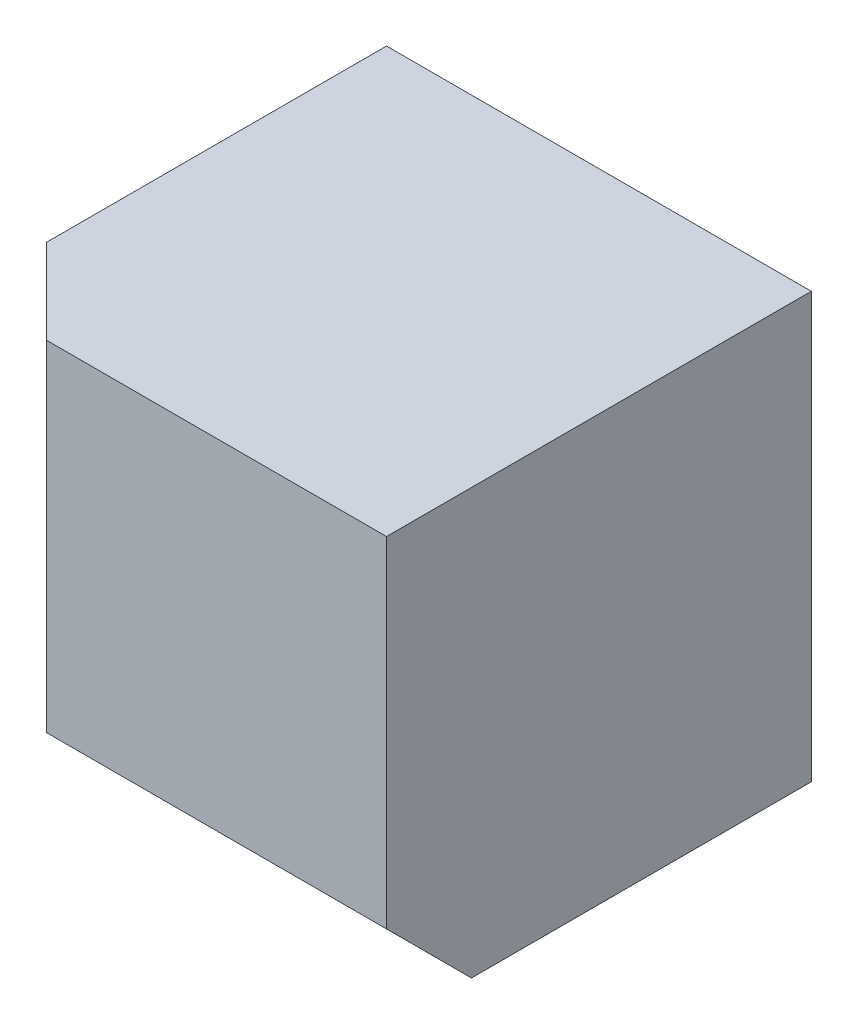
ISO-10303-21;
HEADER;
FILE_DESCRIPTION(('STEP AP214'),'2;1');
FILE_NAME('part.step','',(''),(''),'','','');
FILE_SCHEMA(('AUTOMOTIVE_DESIGN { 1 0 10303 214 1 1 1 1 }'));
ENDSEC;
DATA;
#1=APPLICATION_CONTEXT('core data for automotive mechanical design processes');
#2=APPLICATION_PROTOCOL_DEFINITION('international standard','automotive_design',2000,#1);
#3=PRODUCT_CONTEXT('',#1,'mechanical');
#4=PRODUCT('Part','Part','',(#3));
#5=PRODUCT_RELATED_PRODUCT_CATEGORY('part','',(#4));
#6=PRODUCT_DEFINITION_FORMATION('','',#4);
#7=PRODUCT_DEFINITION_CONTEXT('part definition',#1,'design');
#8=PRODUCT_DEFINITION('design','',#6,#7);
#9=PRODUCT_DEFINITION_SHAPE('','',#8);
#10=(LENGTH_UNIT() NAMED_UNIT(*) SI_UNIT(.MILLI.,.METRE.));
#11=(NAMED_UNIT(*) PLANE_ANGLE_UNIT() SI_UNIT($,.RADIAN.));
#12=(NAMED_UNIT(*) SI_UNIT($,.STERADIAN.) SOLID_ANGLE_UNIT());
#13=UNCERTAINTY_MEASURE_WITH_UNIT(LENGTH_MEASURE(1.E-05),#10,'distance_accuracy_value','');
#14=(GEOMETRIC_REPRESENTATION_CONTEXT(3) GLOBAL_UNCERTAINTY_ASSIGNED_CONTEXT((#13)) GLOBAL_UNIT_ASSIGNED_CONTEXT((#10,
#11,#12)) REPRESENTATION_CONTEXT('',''));
#15=CARTESIAN_POINT('',(0.,0.,0.));
#16=DIRECTION('',(0.,0.,1.));
#17=DIRECTION('',(1.,0.,0.));
#18=AXIS2_PLACEMENT_3D('',#15,#16,#17);
#19=CARTESIAN_POINT('',(-5.,-5.,10.));
#20=DIRECTION('',(-1.,0.,0.));
#21=DIRECTION('',(0.,0.,1.));
#22=AXIS2_PLACEMENT_3D('',#19,#20,#21);
#23=PLANE('',#22);
#24=DIRECTION('',(0.,0.,-1.));
#25=VECTOR('',#24,1.);
#26=CARTESIAN_POINT('',(-5.,-5.,10.));
#27=LINE('',#26,#25);
#28=CARTESIAN_POINT('',(-5.,-5.,7.99999999999999));
#29=VERTEX_POINT('',#28);
#30=CARTESIAN_POINT('',(-5.,-5.,0.));
#31=VERTEX_POINT('',#30);
#32=EDGE_CURVE('E104',#29,#31,#27,.T.);
#33=ORIENTED_EDGE('',*,*,#32,.F.);
#34=DIRECTION('',(0.,1.,0.));
#35=VECTOR('',#34,1.);
#36=CARTESIAN_POINT('',(-5.,5.,7.99999999999999));
#37=LINE('',#36,#35);
#38=CARTESIAN_POINT('',(-5.,5.,7.99999999999999));
#39=VERTEX_POINT('',#38);
#40=EDGE_CURVE('E109',#29,#39,#37,.T.);
#41=ORIENTED_EDGE('',*,*,#40,.T.);
#42=DIRECTION('',(0.,0.,-1.));
#43=VECTOR('',#42,1.);
#44=CARTESIAN_POINT('',(-5.,5.,10.));
#45=LINE('',#44,#43);
#46=CARTESIAN_POINT('',(-5.,5.,0.));
#47=VERTEX_POINT('',#46);
#48=EDGE_CURVE('E87',#39,#47,#45,.T.);
#49=ORIENTED_EDGE('',*,*,#48,.T.);
#50=DIRECTION('',(0.,1.,0.));
#51=VECTOR('',#50,1.);
#52=CARTESIAN_POINT('',(-5.,-5.,0.));
#53=LINE('',#52,#51);
#54=EDGE_CURVE('E126',#31,#47,#53,.T.);
#55=ORIENTED_EDGE('',*,*,#54,.F.);
#56=EDGE_LOOP('',(#33,#41,#49,#55));
#57=FACE_BOUND('',#56,.T.);
#58=ADVANCED_FACE('F33',(#57),#23,.T.);
#59=CARTESIAN_POINT('',(-5.,-5.,10.));
#60=DIRECTION('',(0.,1.,0.));
#61=DIRECTION('',(0.,0.,1.));
#62=AXIS2_PLACEMENT_3D('',#59,#60,#61);
#63=PLANE('',#62);
#64=DIRECTION('',(0.,0.,-1.));
#65=VECTOR('',#64,1.);
#66=CARTESIAN_POINT('',(5.,-5.,10.));
#67=LINE('',#66,#65);
#68=CARTESIAN_POINT('',(5.,-5.,7.99999999999999));
#69=VERTEX_POINT('',#68);
#70=CARTESIAN_POINT('',(5.,-5.,0.));
#71=VERTEX_POINT('',#70);
#72=EDGE_CURVE('E102',#69,#71,#67,.T.);
#73=ORIENTED_EDGE('',*,*,#72,.F.);
#74=DIRECTION('',(-1.,0.,0.));
#75=VECTOR('',#74,1.);
#76=CARTESIAN_POINT('',(-5.,-5.,7.99999999999999));
#77=LINE('',#76,#75);
#78=EDGE_CURVE('E11',#69,#29,#77,.T.);
#79=ORIENTED_EDGE('',*,*,#78,.T.);
#80=ORIENTED_EDGE('',*,*,#32,.T.);
#81=DIRECTION('',(1.,0.,0.));
#82=VECTOR('',#81,1.);
#83=CARTESIAN_POINT('',(-5.,-5.,0.));
#84=LINE('',#83,#82);
#85=EDGE_CURVE('E96',#31,#71,#84,.T.);
#86=ORIENTED_EDGE('',*,*,#85,.T.);
#87=EDGE_LOOP('',(#73,#79,#80,#86));
#88=FACE_BOUND('',#87,.T.);
#89=ADVANCED_FACE('F136',(#88),#63,.F.);
#90=CARTESIAN_POINT('',(5.,-5.,10.));
#91=DIRECTION('',(-1.,0.,0.));
#92=DIRECTION('',(0.,0.,1.));
#93=AXIS2_PLACEMENT_3D('',#90,#91,#92);
#94=PLANE('',#93);
#95=DIRECTION('',(0.,1.,0.));
#96=VECTOR('',#95,1.);
#97=CARTESIAN_POINT('',(5.,-5.,10.));
#98=LINE('',#97,#96);
#99=CARTESIAN_POINT('',(5.,-3.,10.));
#100=VERTEX_POINT('',#99);
#101=CARTESIAN_POINT('',(5.,5.,10.));
#102=VERTEX_POINT('',#101);
#103=EDGE_CURVE('E81',#100,#102,#98,.T.);
#104=ORIENTED_EDGE('',*,*,#103,.F.);
#105=DIRECTION('',(0.,0.707106781186546,0.707106781186549));
#106=VECTOR('',#105,1.);
#107=CARTESIAN_POINT('',(5.,-3.,10.));
#108=LINE('',#107,#106);
#109=EDGE_CURVE('E42',#100,#69,#108,.F.);
#110=ORIENTED_EDGE('',*,*,#109,.T.);
#111=ORIENTED_EDGE('',*,*,#72,.T.);
#112=DIRECTION('',(0.,1.,0.));
#113=VECTOR('',#112,1.);
#114=CARTESIAN_POINT('',(5.,-5.,0.));
#115=LINE('',#114,#113);
#116=CARTESIAN_POINT('',(5.,5.,0.));
#117=VERTEX_POINT('',#116);
#118=EDGE_CURVE('E100',#71,#117,#115,.T.);
#119=ORIENTED_EDGE('',*,*,#118,.T.);
#120=DIRECTION('',(0.,0.,-1.));
#121=VECTOR('',#120,1.);
#122=CARTESIAN_POINT('',(5.,5.,10.));
#123=LINE('',#122,#121);
#124=EDGE_CURVE('E93',#102,#117,#123,.T.);
#125=ORIENTED_EDGE('',*,*,#124,.F.);
#126=EDGE_LOOP('',(#104,#110,#111,#119,#125));
#127=FACE_BOUND('',#126,.T.);
#128=ADVANCED_FACE('F98',(#127),#94,.F.);
#129=CARTESIAN_POINT('',(-5.,5.,10.));
#130=DIRECTION('',(0.,1.,0.));
#131=DIRECTION('',(0.,0.,1.));
#132=AXIS2_PLACEMENT_3D('',#129,#130,#131);
#133=PLANE('',#132);
#134=ORIENTED_EDGE('',*,*,#48,.F.);
#135=DIRECTION('',(0.707106781186546,0.,0.707106781186549));
#136=VECTOR('',#135,1.);
#137=CARTESIAN_POINT('',(-4.,5.,9.));
#138=LINE('',#137,#136);
#139=CARTESIAN_POINT('',(-3.,5.,10.));
#140=VERTEX_POINT('',#139);
#141=EDGE_CURVE('E95',#39,#140,#138,.T.);
#142=ORIENTED_EDGE('',*,*,#141,.T.);
#143=DIRECTION('',(1.,0.,0.));
#144=VECTOR('',#143,1.);
#145=CARTESIAN_POINT('',(-5.,5.,10.));
#146=LINE('',#145,#144);
#147=EDGE_CURVE('E84',#140,#102,#146,.T.);
#148=ORIENTED_EDGE('',*,*,#147,.T.);
#149=ORIENTED_EDGE('',*,*,#124,.T.);
#150=DIRECTION('',(1.,0.,0.));
#151=VECTOR('',#150,1.);
#152=CARTESIAN_POINT('',(-5.,5.,0.));
#153=LINE('',#152,#151);
#154=EDGE_CURVE('E124',#47,#117,#153,.T.);
#155=ORIENTED_EDGE('',*,*,#154,.F.);
#156=EDGE_LOOP('',(#134,#142,#148,#149,#155));
#157=FACE_BOUND('',#156,.T.);
#158=ADVANCED_FACE('F91',(#157),#133,.T.);
#159=CARTESIAN_POINT('',(0.,0.,10.));
#160=DIRECTION('',(0.,0.,-1.));
#161=DIRECTION('',(-1.,0.,0.));
#162=AXIS2_PLACEMENT_3D('',#159,#160,#161);
#163=PLANE('',#162);
#164=ORIENTED_EDGE('',*,*,#147,.F.);
#165=DIRECTION('',(0.,-1.,0.));
#166=VECTOR('',#165,1.);
#167=CARTESIAN_POINT('',(-3.,-5.,10.));
#168=LINE('',#167,#166);
#169=CARTESIAN_POINT('',(-3.,-3.,10.));
#170=VERTEX_POINT('',#169);
#171=EDGE_CURVE('E56',#140,#170,#168,.T.);
#172=ORIENTED_EDGE('',*,*,#171,.T.);
#173=DIRECTION('',(1.,0.,0.));
#174=VECTOR('',#173,1.);
#175=CARTESIAN_POINT('',(0.,-3.,10.));
#176=LINE('',#175,#174);
#177=EDGE_CURVE('E85',#170,#100,#176,.T.);
#178=ORIENTED_EDGE('',*,*,#177,.T.);
#179=ORIENTED_EDGE('',*,*,#103,.T.);
#180=EDGE_LOOP('',(#164,#172,#178,#179));
#181=FACE_BOUND('',#180,.T.);
#182=ADVANCED_FACE('F83',(#181),#163,.F.);
#183=CARTESIAN_POINT('',(0.,0.,0.));
#184=DIRECTION('',(0.,0.,-1.));
#185=DIRECTION('',(-1.,0.,0.));
#186=AXIS2_PLACEMENT_3D('',#183,#184,#185);
#187=PLANE('',#186);
#188=ORIENTED_EDGE('',*,*,#54,.T.);
#189=ORIENTED_EDGE('',*,*,#154,.T.);
#190=ORIENTED_EDGE('',*,*,#118,.F.);
#191=ORIENTED_EDGE('',*,*,#85,.F.);
#192=EDGE_LOOP('',(#188,#189,#190,#191));
#193=FACE_BOUND('',#192,.T.);
#194=ADVANCED_FACE('F137',(#193),#187,.T.);
#195=CARTESIAN_POINT('',(0.,-3.,10.));
#196=DIRECTION('',(0.,0.707106781186549,-0.707106781186546));
#197=DIRECTION('',(1.,0.,0.));
#198=AXIS2_PLACEMENT_3D('',#195,#196,#197);
#199=PLANE('',#198);
#200=ORIENTED_EDGE('',*,*,#109,.F.);
#201=ORIENTED_EDGE('',*,*,#177,.F.);
#202=DIRECTION('',(0.577350269189625,0.577350269189625,0.577350269189627));
#203=VECTOR('',#202,1.);
#204=CARTESIAN_POINT('',(-2.,-2.,11.));
#205=LINE('',#204,#203);
#206=EDGE_CURVE('E37',#29,#170,#205,.T.);
#207=ORIENTED_EDGE('',*,*,#206,.F.);
#208=ORIENTED_EDGE('',*,*,#78,.F.);
#209=EDGE_LOOP('',(#200,#201,#207,#208));
#210=FACE_BOUND('',#209,.T.);
#211=ADVANCED_FACE('F35',(#210),#199,.F.);
#212=CARTESIAN_POINT('',(-5.,-5.,7.99999999999999));
#213=DIRECTION('',(-0.707106781186549,0.,0.707106781186546));
#214=DIRECTION('',(0.,-1.,0.));
#215=AXIS2_PLACEMENT_3D('',#212,#213,#214);
#216=PLANE('',#215);
#217=ORIENTED_EDGE('',*,*,#206,.T.);
#218=ORIENTED_EDGE('',*,*,#171,.F.);
#219=ORIENTED_EDGE('',*,*,#141,.F.);
#220=ORIENTED_EDGE('',*,*,#40,.F.);
#221=EDGE_LOOP('',(#217,#218,#219,#220));
#222=FACE_BOUND('',#221,.T.);
#223=ADVANCED_FACE('F133',(#222),#216,.T.);
#224=CLOSED_SHELL('',(#58,#89,#128,#158,#182,#194,#211,#223));
#225=MANIFOLD_SOLID_BREP('B2',#224);
#226=ADVANCED_BREP_SHAPE_REPRESENTATION('',(#18,#225),#14);
#227=SHAPE_DEFINITION_REPRESENTATION(#9,#226);
ENDSEC;
END-ISO-10303-21;
